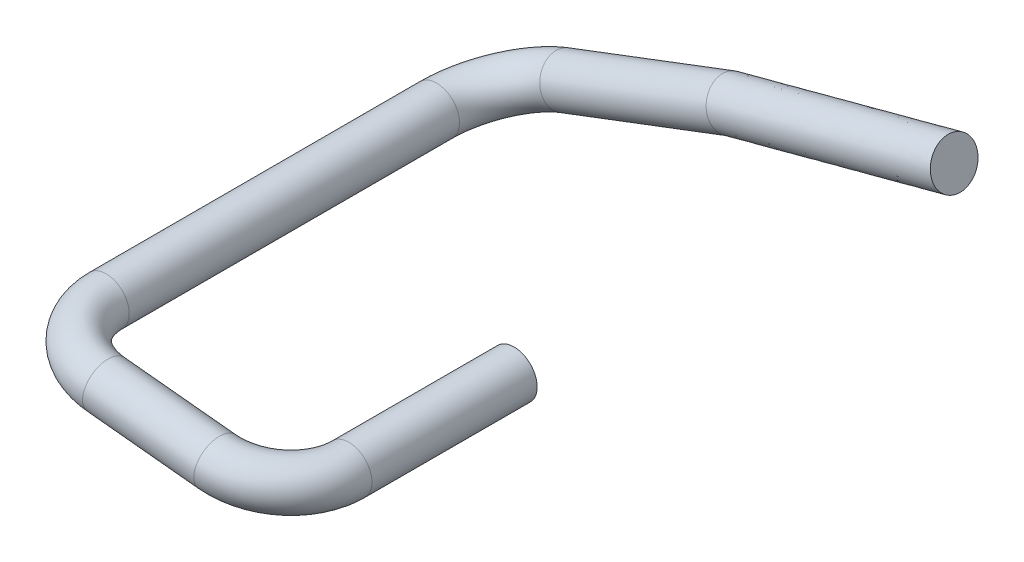
ISO-10303-21;
HEADER;
FILE_DESCRIPTION(('STEP AP214'),'2;1');
FILE_NAME('part.step','',(''),(''),'','','');
FILE_SCHEMA(('AUTOMOTIVE_DESIGN { 1 0 10303 214 1 1 1 1 }'));
ENDSEC;
DATA;
#1=APPLICATION_CONTEXT('core data for automotive mechanical design processes');
#2=APPLICATION_PROTOCOL_DEFINITION('international standard','automotive_design',2000,#1);
#3=PRODUCT_CONTEXT('',#1,'mechanical');
#4=PRODUCT('Part','Part','',(#3));
#5=PRODUCT_RELATED_PRODUCT_CATEGORY('part','',(#4));
#6=PRODUCT_DEFINITION_FORMATION('','',#4);
#7=PRODUCT_DEFINITION_CONTEXT('part definition',#1,'design');
#8=PRODUCT_DEFINITION('design','',#6,#7);
#9=PRODUCT_DEFINITION_SHAPE('','',#8);
#10=(LENGTH_UNIT() NAMED_UNIT(*) SI_UNIT(.MILLI.,.METRE.));
#11=(NAMED_UNIT(*) PLANE_ANGLE_UNIT() SI_UNIT($,.RADIAN.));
#12=(NAMED_UNIT(*) SI_UNIT($,.STERADIAN.) SOLID_ANGLE_UNIT());
#13=UNCERTAINTY_MEASURE_WITH_UNIT(LENGTH_MEASURE(1.E-05),#10,'distance_accuracy_value','');
#14=(GEOMETRIC_REPRESENTATION_CONTEXT(3) GLOBAL_UNCERTAINTY_ASSIGNED_CONTEXT((#13)) GLOBAL_UNIT_ASSIGNED_CONTEXT((#10,
#11,#12)) REPRESENTATION_CONTEXT('',''));
#15=CARTESIAN_POINT('',(0.,0.,0.));
#16=DIRECTION('',(0.,0.,1.));
#17=DIRECTION('',(1.,0.,0.));
#18=AXIS2_PLACEMENT_3D('',#15,#16,#17);
#19=CARTESIAN_POINT('',(6.5,0.,0.));
#20=DIRECTION('',(0.,0.,-1.));
#21=DIRECTION('',(-1.,0.,0.));
#22=AXIS2_PLACEMENT_3D('',#19,#20,#21);
#23=PLANE('',#22);
#24=CARTESIAN_POINT('',(6.5,0.,0.));
#25=DIRECTION('',(0.,0.,-1.));
#26=DIRECTION('',(0.,1.,0.));
#27=AXIS2_PLACEMENT_3D('',#24,#25,#26);
#28=CIRCLE('',#27,0.35);
#29=CARTESIAN_POINT('',(6.5,0.349999999999999,0.));
#30=VERTEX_POINT('',#29);
#31=EDGE_CURVE('E18',#30,#30,#28,.F.);
#32=ORIENTED_EDGE('',*,*,#31,.F.);
#33=EDGE_LOOP('',(#32));
#34=FACE_BOUND('',#33,.T.);
#35=ADVANCED_FACE('F15',(#34),#23,.T.);
#36=CARTESIAN_POINT('',(6.5,0.,2.5));
#37=DIRECTION('',(0.,0.,-1.));
#38=DIRECTION('',(0.,1.,0.));
#39=AXIS2_PLACEMENT_3D('',#36,#37,#38);
#40=CYLINDRICAL_SURFACE('',#39,0.35);
#41=CARTESIAN_POINT('',(6.5,0.,2.5));
#42=DIRECTION('',(0.,0.,-1.));
#43=DIRECTION('',(0.994914151503573,-0.100726516558078,0.));
#44=AXIS2_PLACEMENT_3D('',#41,#42,#43);
#45=CIRCLE('',#44,0.35);
#46=CARTESIAN_POINT('',(6.84821995302625,-0.0352542807953284,2.5));
#47=VERTEX_POINT('',#46);
#48=EDGE_CURVE('E58',#47,#47,#45,.F.);
#49=ORIENTED_EDGE('',*,*,#48,.F.);
#50=EDGE_LOOP('',(#49));
#51=FACE_BOUND('',#50,.T.);
#52=ORIENTED_EDGE('',*,*,#31,.T.);
#53=EDGE_LOOP('',(#52));
#54=FACE_BOUND('',#53,.T.);
#55=ADVANCED_FACE('F73',(#51,#54),#40,.T.);
#56=CARTESIAN_POINT('',(9.53167313141475,3.06935216086955,-3.50000000000001));
#57=DIRECTION('',(-0.966079467892424,-0.258244964552442,0.));
#58=DIRECTION('',(0.258244964552442,-0.966079467892424,0.));
#59=AXIS2_PLACEMENT_3D('',#56,#57,#58);
#60=PLANE('',#59);
#61=CARTESIAN_POINT('',(9.66076169643821,2.58643930940313,-3.15));
#62=CARTESIAN_POINT('',(9.66579720338818,2.56760176930539,-3.14999791451422));
#63=CARTESIAN_POINT('',(9.67082945589496,2.54877640389131,-3.15164861973238));
#64=CARTESIAN_POINT('',(9.68075865150334,2.5116318577176,-3.15820215186045));
#65=CARTESIAN_POINT('',(9.68565542420501,2.49331331441426,-3.16310889617471));
#66=CARTESIAN_POINT('',(9.69515938605322,2.4577595431293,-3.17602802954534));
#67=CARTESIAN_POINT('',(9.69976697098423,2.44052283454092,-3.18403606147579));
#68=CARTESIAN_POINT('',(9.708577195344,2.40756429505399,-3.20293836809555));
#69=CARTESIAN_POINT('',(9.71277926257943,2.39184460469759,-3.21383664204717));
#70=CARTESIAN_POINT('',(9.72065708811174,2.36237411526678,-3.23821120968002));
#71=CARTESIAN_POINT('',(9.72433236731732,2.34862510844519,-3.25168982438119));
#72=CARTESIAN_POINT('',(9.73105504360669,2.32347596548437,-3.28085385863624));
#73=CARTESIAN_POINT('',(9.73410154279563,2.31207918831782,-3.29654238090849));
#74=CARTESIAN_POINT('',(9.73948562562265,2.29193764603592,-3.3297241401582));
#75=CARTESIAN_POINT('',(9.74182071322194,2.28320221845725,-3.34722344924271));
#76=CARTESIAN_POINT('',(9.74570632433112,2.26866637215606,-3.38351159811163));
#77=CARTESIAN_POINT('',(9.74725572658146,2.26287014800062,-3.40230223761452));
#78=CARTESIAN_POINT('',(9.74952626736976,2.25437618630655,-3.44068240878773));
#79=CARTESIAN_POINT('',(9.75024475482607,2.25168836631098,-3.4602742921608));
#80=CARTESIAN_POINT('',(9.7508252828597,2.24951664453204,-3.49967521497899));
#81=CARTESIAN_POINT('',(9.75068610980258,2.25003728288488,-3.51948452253353));
#82=CARTESIAN_POINT('',(9.74955177985591,2.2542807455723,-3.55875041429241));
#83=CARTESIAN_POINT('',(9.74855585022945,2.25800646067096,-3.57820666388163));
#84=CARTESIAN_POINT('',(9.74573235736935,2.26856898406655,-3.61622221705729));
#85=CARTESIAN_POINT('',(9.74390363222358,2.27541013900954,-3.63478022727051));
#86=CARTESIAN_POINT('',(9.73947029877668,2.29199498287975,-3.67039560466865));
#87=CARTESIAN_POINT('',(9.73686755759817,2.30173168700931,-3.68745645655268));
#88=CARTESIAN_POINT('',(9.73095291316165,2.32385802956901,-3.71965954156408));
#89=CARTESIAN_POINT('',(9.72764003504181,2.33625131490082,-3.73479909121704));
#90=CARTESIAN_POINT('',(9.72041991020155,2.36326138410349,-3.76261732943667));
#91=CARTESIAN_POINT('',(9.71651588567207,2.37786611394445,-3.77530855844652));
#92=CARTESIAN_POINT('',(9.70820508392003,2.40895634235717,-3.79797552778187));
#93=CARTESIAN_POINT('',(9.70379762183473,2.42544440296082,-3.80794750495601));
#94=CARTESIAN_POINT('',(9.69464062274781,2.45970020663432,-3.82480301232005));
#95=CARTESIAN_POINT('',(9.68989352229551,2.4774588347142,-3.83170639480795));
#96=CARTESIAN_POINT('',(9.68015869907059,2.51387624504961,-3.84232671879145));
#97=CARTESIAN_POINT('',(9.67517059392555,2.53253645773822,-3.84603840854675));
#98=CARTESIAN_POINT('',(9.66512427396176,2.57011915934758,-3.85013798230738));
#99=CARTESIAN_POINT('',(9.66006641771977,2.58904030685343,-3.85053905206071));
#100=CARTESIAN_POINT('',(9.65001379160875,2.62664659939464,-3.84804246805131));
#101=CARTESIAN_POINT('',(9.64501893062779,2.64533208527448,-3.84515031230122));
#102=CARTESIAN_POINT('',(9.63522375326206,2.681975276958,-3.8361591942369));
#103=CARTESIAN_POINT('',(9.63042350513207,2.6999327274245,-3.83005911713987));
#104=CARTESIAN_POINT('',(9.62116151072463,2.73458131251603,-3.81483995978501));
#105=CARTESIAN_POINT('',(9.61669930869625,2.75127415207896,-3.80572503646304));
#106=CARTESIAN_POINT('',(9.60821596127665,2.78300986384892,-3.78469982572047));
#107=CARTESIAN_POINT('',(9.60419642287994,2.79804672438244,-3.77277981625736));
#108=CARTESIAN_POINT('',(9.59673386299468,2.82596372905884,-3.74652325340762));
#109=CARTESIAN_POINT('',(9.59329007054916,2.83884675730709,-3.73218998401346));
#110=CARTESIAN_POINT('',(9.58704881253152,2.86219494237282,-3.7014120221235));
#111=CARTESIAN_POINT('',(9.58425527118697,2.87264541888205,-3.68495539656457));
#112=CARTESIAN_POINT('',(9.5794211422435,2.8907296155111,-3.65048969385263));
#113=CARTESIAN_POINT('',(9.57737954125889,2.8983671266482,-3.63248274676345));
#114=CARTESIAN_POINT('',(9.57408922245147,2.91067601889775,-3.59528619564929));
#115=CARTESIAN_POINT('',(9.57284558643152,2.91532838927983,-3.57608984903491));
#116=CARTESIAN_POINT('',(9.5712070231959,2.92145815952149,-3.5371890817355));
#117=CARTESIAN_POINT('',(9.57081093274273,2.92293991098529,-3.51748539502593));
#118=CARTESIAN_POINT('',(9.5708749398144,2.92270046423423,-3.47800790954186));
#119=CARTESIAN_POINT('',(9.57133897780114,2.92096452497942,-3.45823420435761));
#120=CARTESIAN_POINT('',(9.57311697431509,2.91431314291244,-3.41929704299045));
#121=CARTESIAN_POINT('',(9.5744297385202,2.90940216799012,-3.40013276891868));
#122=CARTESIAN_POINT('',(9.57787045719635,2.89653063853521,-3.36290239359777));
#123=CARTESIAN_POINT('',(9.57999961046557,2.888565599368,-3.34483795277843));
#124=CARTESIAN_POINT('',(9.58501015375496,2.86982144687984,-3.31038146906657));
#125=CARTESIAN_POINT('',(9.58789046290857,2.85904637701813,-3.29398706984509));
#126=CARTESIAN_POINT('',(9.5943187049197,2.83499869565345,-3.26334075346839));
#127=CARTESIAN_POINT('',(9.59786549379887,2.82173036370725,-3.24908523933583));
#128=CARTESIAN_POINT('',(9.6055243051751,2.79307919356007,-3.22311638839694));
#129=CARTESIAN_POINT('',(9.60963551394584,2.77769939946217,-3.2113994532998));
#130=CARTESIAN_POINT('',(9.61829515563471,2.74530418103297,-3.19086262764124));
#131=CARTESIAN_POINT('',(9.62284195771898,2.72829485755676,-3.18203243820997));
#132=CARTESIAN_POINT('',(9.6322476636957,2.693108655801,-3.16747886321081));
#133=CARTESIAN_POINT('',(9.63710617303502,2.67493325352196,-3.161751633482));
#134=CARTESIAN_POINT('',(9.64819857214203,2.63343723037382,-3.15257510473023));
#135=CARTESIAN_POINT('',(9.65448266443676,2.60992880475629,-3.15000260049924));
#136=CARTESIAN_POINT('',(9.66076169643821,2.58643930940313,-3.15));
#137=B_SPLINE_CURVE_WITH_KNOTS('',3,(#61,#62,#63,#64,#65,#66,#67,#68,#69,#70,#71,#72,#73,#74,
#75,#76,#77,#78,#79,#80,#81,#82,#83,#84,#85,#86,#87,#88,#89,#90,#91,#92,#93,#94,#95,#96,#97,#98,
#99,#100,#101,#102,#103,#104,#105,#106,#107,#108,#109,#110,#111,#112,#113,#114,#115,#116,#117,
#118,#119,#120,#121,#122,#123,#124,#125,#126,#127,#128,#129,#130,#131,#132,#133,#134,#135,#136),
.UNSPECIFIED.,.T.,.F.,(4,2,2,2,2,2,2,2,2,2,2,2,2,2,2,2,2,2,2,2,2,2,2,2,2,2,2,2,2,2,2,2,2,2,2,2,
2,4),(0.,0.0584059861638105,0.116882369424953,0.175276893134587,0.233752643488833,
0.292281242123789,0.350892849719176,0.40970779296729,0.468606437050331,0.527692486684429,
0.586862165346322,0.64608526710625,0.70539125099245,0.764555318522248,0.82380113148163,
0.882734920467541,0.941749858264383,1.00037723472733,1.05910089545681,1.11759055443898,
1.17598270840894,1.2343951676229,1.29272741989049,1.35126490127167,1.40972335863189,
1.46852595672178,1.52724901436823,1.58634242954722,1.6453546881634,1.70463796501443,
1.76383799986117,1.82312529993264,1.8823277555172,1.94142950627981,2.00044692752229,
2.0592514378247,2.11798292947795,2.19081235059521),.UNSPECIFIED.);
#138=CARTESIAN_POINT('',(9.66076169643821,2.58643930940313,-3.15));
#139=VERTEX_POINT('',#138);
#140=EDGE_CURVE('E55',#139,#139,#137,.T.);
#141=ORIENTED_EDGE('',*,*,#140,.T.);
#142=EDGE_LOOP('',(#141));
#143=FACE_BOUND('',#142,.T.);
#144=ADVANCED_FACE('F66',(#143),#60,.F.);
#145=CARTESIAN_POINT('',(5.50508584849643,0.100726516558077,2.5));
#146=DIRECTION('',(0.100726516558078,0.994914151503573,0.));
#147=DIRECTION('',(0.,0.,1.));
#148=AXIS2_PLACEMENT_3D('',#145,#146,#147);
#149=TOROIDAL_SURFACE('',#148,1.,0.35);
#150=CARTESIAN_POINT('',(5.50508584849643,0.100726516558077,3.5));
#151=DIRECTION('',(0.994914151503573,-0.100726516558078,0.));
#152=DIRECTION('',(0.100726516558078,0.994914151503573,0.));
#153=AXIS2_PLACEMENT_3D('',#150,#151,#152);
#154=CIRCLE('',#153,0.35);
#155=CARTESIAN_POINT('',(5.54034012929176,0.448946469584328,3.5));
#156=VERTEX_POINT('',#155);
#157=EDGE_CURVE('E52',#156,#156,#154,.F.);
#158=ORIENTED_EDGE('',*,*,#157,.F.);
#159=EDGE_LOOP('',(#158));
#160=FACE_BOUND('',#159,.T.);
#161=ORIENTED_EDGE('',*,*,#48,.T.);
#162=EDGE_LOOP('',(#161));
#163=FACE_BOUND('',#162,.T.);
#164=ADVANCED_FACE('F61',(#160,#163),#149,.T.);
#165=CARTESIAN_POINT('',(6.23669411816194,1.67114378790097,-3.15));
#166=CARTESIAN_POINT('',(6.32661474119793,1.33475594078179,-3.14999999999999));
#167=CARTESIAN_POINT('',(6.32661474119793,1.33475594078178,-3.49999999999999));
#168=CARTESIAN_POINT('',(6.32661474119793,1.33475594078178,-3.84999999999999));
#169=CARTESIAN_POINT('',(6.23669411816194,1.67114378790095,-3.85));
#170=CARTESIAN_POINT('',(6.14677349512595,2.00753163502013,-3.85000000000001));
#171=CARTESIAN_POINT('',(6.14677349512595,2.00753163502014,-3.50000000000001));
#172=CARTESIAN_POINT('',(6.14677349512595,2.00753163502015,-3.15000000000001));
#173=CARTESIAN_POINT('',(6.23669411816194,1.67114378790097,-3.15));
#174=CARTESIAN_POINT('',(9.66076169643821,2.58643930940313,-3.15));
#175=CARTESIAN_POINT('',(9.7506823194742,2.25005146228395,-3.14999999999999));
#176=CARTESIAN_POINT('',(9.75068231947421,2.25005146228394,-3.49999999999999));
#177=CARTESIAN_POINT('',(9.75068231947421,2.25005146228393,-3.84999999999999));
#178=CARTESIAN_POINT('',(9.66076169643822,2.58643930940311,-3.85));
#179=CARTESIAN_POINT('',(9.57084107340223,2.92282715652229,-3.85000000000001));
#180=CARTESIAN_POINT('',(9.57084107340223,2.9228271565223,-3.50000000000001));
#181=CARTESIAN_POINT('',(9.57084107340222,2.92282715652231,-3.15000000000001));
#182=CARTESIAN_POINT('',(9.66076169643821,2.58643930940313,-3.15));
#183=(BOUNDED_SURFACE() B_SPLINE_SURFACE(1,2,((#165,#166,#167,#168,#169,#170,#171,#172,#173),
(#174,#175,#176,#177,#178,#179,#180,#181,#182)),.UNSPECIFIED.,.F.,.T.,
.F.) B_SPLINE_SURFACE_WITH_KNOTS((2,2),(3,2,2,2,3),(-0.123692139524501,10.002855984916),
(-3.14159265358979,-1.5707963267949,0.,1.5707963267949,3.14159265358979),
.UNSPECIFIED.) GEOMETRIC_REPRESENTATION_ITEM() RATIONAL_B_SPLINE_SURFACE(((1.,0.707106781186548,
1.,0.707106781186548,1.,0.707106781186548,1.,0.707106781186548,1.),(1.,0.707106781186548,1.,
0.707106781186548,1.,0.707106781186548,1.,0.707106781186548,1.))) REPRESENTATION_ITEM('') SURFACE());
#184=CARTESIAN_POINT('',(6.27851787087895,1.68232379316639,-3.5));
#185=DIRECTION('',(0.934943333045712,0.35479707438672,0.));
#186=DIRECTION('',(-0.35479707438672,0.934943333045712,0.));
#187=AXIS2_PLACEMENT_3D('',#184,#185,#186);
#188=CIRCLE('',#187,0.35);
#189=CARTESIAN_POINT('',(6.27851787087895,1.68232379316639,-3.15));
#190=VERTEX_POINT('',#189);
#191=EDGE_CURVE('E51',#190,#190,#188,.F.);
#192=CARTESIAN_POINT('',(6.27851787087895,1.68232379316639,-3.15));
#193=CARTESIAN_POINT('',(6.31374957739519,1.69174166312719,-3.15));
#194=CARTESIAN_POINT('',(6.34898128391143,1.70115953308799,-3.15));
#195=CARTESIAN_POINT('',(6.41944469694392,1.71999527300959,-3.15));
#196=CARTESIAN_POINT('',(6.45467640346016,1.72941314297039,-3.15));
#197=CARTESIAN_POINT('',(6.52513981649264,1.74824888289199,-3.15));
#198=CARTESIAN_POINT('',(6.56037152300889,1.75766675285279,-3.15));
#199=CARTESIAN_POINT('',(6.63083493604137,1.77650249277439,-3.15));
#200=CARTESIAN_POINT('',(6.66606664255761,1.78592036273519,-3.15));
#201=CARTESIAN_POINT('',(6.7365300555901,1.80475610265678,-3.15));
#202=CARTESIAN_POINT('',(6.77176176210634,1.81417397261758,-3.15));
#203=CARTESIAN_POINT('',(6.84222517513883,1.83300971253918,-3.15));
#204=CARTESIAN_POINT('',(6.87745688165507,1.84242758249998,-3.15));
#205=CARTESIAN_POINT('',(6.94792029468755,1.86126332242158,-3.15));
#206=CARTESIAN_POINT('',(6.98315200120379,1.87068119238238,-3.15));
#207=CARTESIAN_POINT('',(7.05361541423628,1.88951693230398,-3.15));
#208=CARTESIAN_POINT('',(7.08884712075252,1.89893480226478,-3.15));
#209=CARTESIAN_POINT('',(7.15931053378501,1.91777054218638,-3.15));
#210=CARTESIAN_POINT('',(7.19454224030125,1.92718841214718,-3.15));
#211=CARTESIAN_POINT('',(7.26500565333373,1.94602415206877,-3.15));
#212=CARTESIAN_POINT('',(7.30023735984997,1.95544202202957,-3.15));
#213=CARTESIAN_POINT('',(7.37070077288246,1.97427776195117,-3.15));
#214=CARTESIAN_POINT('',(7.4059324793987,1.98369563191197,-3.15));
#215=CARTESIAN_POINT('',(7.47639589243119,2.00253137183357,-3.15));
#216=CARTESIAN_POINT('',(7.51162759894743,2.01194924179437,-3.15));
#217=CARTESIAN_POINT('',(7.58209101197991,2.03078498171597,-3.15));
#218=CARTESIAN_POINT('',(7.61732271849615,2.04020285167677,-3.15));
#219=CARTESIAN_POINT('',(7.68778613152864,2.05903859159837,-3.15));
#220=CARTESIAN_POINT('',(7.72301783804488,2.06845646155917,-3.15));
#221=CARTESIAN_POINT('',(7.79348125107737,2.08729220148077,-3.15));
#222=CARTESIAN_POINT('',(7.82871295759361,2.09671007144156,-3.15));
#223=CARTESIAN_POINT('',(7.89917637062609,2.11554581136316,-3.15));
#224=CARTESIAN_POINT('',(7.93440807714234,2.12496368132396,-3.15));
#225=CARTESIAN_POINT('',(8.00487149017482,2.14379942124556,-3.15));
#226=CARTESIAN_POINT('',(8.04010319669106,2.15321729120636,-3.15));
#227=CARTESIAN_POINT('',(8.11056660972355,2.17205303112796,-3.15));
#228=CARTESIAN_POINT('',(8.14579831623979,2.18147090108876,-3.15));
#229=CARTESIAN_POINT('',(8.21626172927228,2.20030664101036,-3.15));
#230=CARTESIAN_POINT('',(8.25149343578852,2.20972451097116,-3.15));
#231=CARTESIAN_POINT('',(8.321956848821,2.22856025089275,-3.15));
#232=CARTESIAN_POINT('',(8.35718855533725,2.23797812085355,-3.15));
#233=CARTESIAN_POINT('',(8.42765196836973,2.25681386077515,-3.15));
#234=CARTESIAN_POINT('',(8.46288367488597,2.26623173073595,-3.15));
#235=CARTESIAN_POINT('',(8.53334708791846,2.28506747065755,-3.15));
#236=CARTESIAN_POINT('',(8.5685787944347,2.29448534061835,-3.15));
#237=CARTESIAN_POINT('',(8.63904220746718,2.31332108053995,-3.15));
#238=CARTESIAN_POINT('',(8.67427391398343,2.32273895050075,-3.15));
#239=CARTESIAN_POINT('',(8.74473732701591,2.34157469042235,-3.15));
#240=CARTESIAN_POINT('',(8.77996903353215,2.35099256038315,-3.15));
#241=CARTESIAN_POINT('',(8.85043244656464,2.36982830030475,-3.15));
#242=CARTESIAN_POINT('',(8.88566415308088,2.37924617026554,-3.15));
#243=CARTESIAN_POINT('',(8.95612756611336,2.39808191018714,-3.15));
#244=CARTESIAN_POINT('',(8.99135927262961,2.40749978014794,-3.15));
#245=CARTESIAN_POINT('',(9.06182268566209,2.42633552006954,-3.15));
#246=CARTESIAN_POINT('',(9.09705439217833,2.43575339003034,-3.15));
#247=CARTESIAN_POINT('',(9.16751780521082,2.45458912995194,-3.15));
#248=CARTESIAN_POINT('',(9.20274951172706,2.46400699991274,-3.15));
#249=CARTESIAN_POINT('',(9.27321292475954,2.48284273983434,-3.15));
#250=CARTESIAN_POINT('',(9.30844463127579,2.49226060979514,-3.15));
#251=CARTESIAN_POINT('',(9.37890804430827,2.51109634971674,-3.15));
#252=CARTESIAN_POINT('',(9.41413975082451,2.52051421967753,-3.15));
#253=CARTESIAN_POINT('',(9.484603163857,2.53934995959913,-3.15));
#254=CARTESIAN_POINT('',(9.51983487037324,2.54876782955993,-3.15));
#255=CARTESIAN_POINT('',(9.59029828340572,2.56760356948153,-3.15));
#256=CARTESIAN_POINT('',(9.62552998992197,2.57702143944233,-3.15));
#257=CARTESIAN_POINT('',(9.66076169643821,2.58643930940313,-3.15));
#258=B_SPLINE_CURVE_WITH_KNOTS('',3,(#192,#193,#194,#195,#196,#197,#198,#199,#200,#201,#202,
#203,#204,#205,#206,#207,#208,#209,#210,#211,#212,#213,#214,#215,#216,#217,#218,#219,#220,#221,
#222,#223,#224,#225,#226,#227,#228,#229,#230,#231,#232,#233,#234,#235,#236,#237,#238,#239,#240,
#241,#242,#243,#244,#245,#246,#247,#248,#249,#250,#251,#252,#253,#254,#255,#256,#257),
.UNSPECIFIED.,.F.,.F.,(4,2,2,2,2,2,2,2,2,2,2,2,2,2,2,2,2,2,2,2,2,2,2,2,2,2,2,2,2,2,2,2,4),(0.,
0.109406237335018,0.218812474670038,0.328218712005055,0.437624949340074,0.547031186675093,
0.656437424010111,0.76584366134513,0.875249898680148,0.984656136015168,1.09406237335019,
1.2034686106852,1.31287484802022,1.42228108535524,1.53168732269026,1.64109356002528,
1.7504997973603,1.85990603469532,1.96931227203034,2.07871850936535,2.18812474670037,
2.29753098403539,2.40693722137041,2.51634345870543,2.62574969604045,2.73515593337546,
2.84456217071048,2.9539684080455,3.06337464538052,3.17278088271554,3.28218712005056,
3.39159335738557,3.50099959472059),.UNSPECIFIED.);
#259=EDGE_CURVE('BSEAM65',#190,#139,#258,.T.);
#260=ORIENTED_EDGE('',*,*,#191,.F.);
#261=ORIENTED_EDGE('',*,*,#140,.F.);
#262=ORIENTED_EDGE('',*,*,#259,.T.);
#263=ORIENTED_EDGE('',*,*,#259,.F.);
#264=EDGE_LOOP('',(#260,#262,#261,#263));
#265=FACE_BOUND('',#264,.T.);
#266=ADVANCED_FACE('F65',(#265),#183,.F.);
#267=CARTESIAN_POINT('',(3.82053200641893,0.271273131269069,3.5));
#268=DIRECTION('',(0.994914151503573,-0.100726516558078,0.));
#269=DIRECTION('',(0.100726516558078,0.994914151503573,0.));
#270=AXIS2_PLACEMENT_3D('',#267,#268,#269);
#271=CYLINDRICAL_SURFACE('',#270,0.35);
#272=CARTESIAN_POINT('',(3.82053200641893,0.271273131269069,3.5));
#273=DIRECTION('',(0.994914151503573,-0.100726516558078,0.));
#274=DIRECTION('',(0.,0.,1.));
#275=AXIS2_PLACEMENT_3D('',#272,#273,#274);
#276=CIRCLE('',#275,0.35);
#277=CARTESIAN_POINT('',(3.82053200641893,0.271273131269069,3.85));
#278=VERTEX_POINT('',#277);
#279=EDGE_CURVE('E48',#278,#278,#276,.F.);
#280=ORIENTED_EDGE('',*,*,#279,.F.);
#281=EDGE_LOOP('',(#280));
#282=FACE_BOUND('',#281,.T.);
#283=ORIENTED_EDGE('',*,*,#157,.T.);
#284=EDGE_LOOP('',(#283));
#285=FACE_BOUND('',#284,.T.);
#286=ADVANCED_FACE('F84',(#282,#285),#271,.T.);
#287=CARTESIAN_POINT('',(3.76056118796107,0.726796722213867,-3.5));
#288=DIRECTION('',(0.934943333045712,0.35479707438672,0.));
#289=DIRECTION('',(-0.35479707438672,0.934943333045712,0.));
#290=AXIS2_PLACEMENT_3D('',#287,#288,#289);
#291=CYLINDRICAL_SURFACE('',#290,0.35);
#292=CARTESIAN_POINT('',(3.76056118796107,0.726796722213867,-3.5));
#293=DIRECTION('',(0.934943333045712,0.35479707438672,0.));
#294=DIRECTION('',(0.,0.,-1.));
#295=AXIS2_PLACEMENT_3D('',#292,#293,#294);
#296=CIRCLE('',#295,0.35);
#297=CARTESIAN_POINT('',(3.76056118796107,0.726796722213867,-3.85));
#298=VERTEX_POINT('',#297);
#299=EDGE_CURVE('E27',#298,#298,#296,.F.);
#300=ORIENTED_EDGE('',*,*,#299,.F.);
#301=EDGE_LOOP('',(#300));
#302=FACE_BOUND('',#301,.T.);
#303=ORIENTED_EDGE('',*,*,#191,.T.);
#304=EDGE_LOOP('',(#303));
#305=FACE_BOUND('',#304,.T.);
#306=ADVANCED_FACE('F43',(#302,#305),#291,.T.);
#307=CARTESIAN_POINT('',(3.82053200641893,0.271273131269069,2.5));
#308=DIRECTION('',(0.100726516558078,0.994914151503573,0.));
#309=DIRECTION('',(0.,0.,1.));
#310=AXIS2_PLACEMENT_3D('',#307,#308,#309);
#311=TOROIDAL_SURFACE('',#310,1.,0.35);
#312=CARTESIAN_POINT('',(2.82561785491536,0.371999647827147,2.5));
#313=DIRECTION('',(0.,0.,1.));
#314=DIRECTION('',(0.,-1.,0.));
#315=AXIS2_PLACEMENT_3D('',#312,#313,#314);
#316=CIRCLE('',#315,0.35);
#317=CARTESIAN_POINT('',(2.82561785491536,0.021999647827147,2.5));
#318=VERTEX_POINT('',#317);
#319=EDGE_CURVE('E22',#318,#318,#316,.F.);
#320=ORIENTED_EDGE('',*,*,#319,.F.);
#321=EDGE_LOOP('',(#320));
#322=FACE_BOUND('',#321,.T.);
#323=ORIENTED_EDGE('',*,*,#279,.T.);
#324=EDGE_LOOP('',(#323));
#325=FACE_BOUND('',#324,.T.);
#326=ADVANCED_FACE('F39',(#322,#325),#311,.T.);
#327=CARTESIAN_POINT('',(3.76056118796107,0.726796722213867,-2.5));
#328=DIRECTION('',(0.35479707438672,-0.934943333045712,0.));
#329=DIRECTION('',(0.,0.,-1.));
#330=AXIS2_PLACEMENT_3D('',#327,#328,#329);
#331=TOROIDAL_SURFACE('',#330,1.,0.35);
#332=CARTESIAN_POINT('',(2.82561785491536,0.371999647827147,-2.5));
#333=DIRECTION('',(0.,0.,1.));
#334=DIRECTION('',(0.,-1.,0.));
#335=AXIS2_PLACEMENT_3D('',#332,#333,#334);
#336=CIRCLE('',#335,0.35);
#337=CARTESIAN_POINT('',(2.82561785491536,0.0219996478271469,-2.5));
#338=VERTEX_POINT('',#337);
#339=EDGE_CURVE('E10',#338,#338,#336,.T.);
#340=ORIENTED_EDGE('',*,*,#339,.F.);
#341=EDGE_LOOP('',(#340));
#342=FACE_BOUND('',#341,.T.);
#343=ORIENTED_EDGE('',*,*,#299,.T.);
#344=EDGE_LOOP('',(#343));
#345=FACE_BOUND('',#344,.T.);
#346=ADVANCED_FACE('F34',(#342,#345),#331,.T.);
#347=CARTESIAN_POINT('',(2.82561785491536,0.371999647827147,0.));
#348=DIRECTION('',(0.,0.,1.));
#349=DIRECTION('',(0.,-1.,0.));
#350=AXIS2_PLACEMENT_3D('',#347,#348,#349);
#351=CYLINDRICAL_SURFACE('',#350,0.35);
#352=ORIENTED_EDGE('',*,*,#339,.T.);
#353=EDGE_LOOP('',(#352));
#354=FACE_BOUND('',#353,.T.);
#355=ORIENTED_EDGE('',*,*,#319,.T.);
#356=EDGE_LOOP('',(#355));
#357=FACE_BOUND('',#356,.T.);
#358=ADVANCED_FACE('F38',(#354,#357),#351,.T.);
#359=CLOSED_SHELL('',(#35,#55,#144,#164,#266,#286,#306,#326,#346,#358));
#360=MANIFOLD_SOLID_BREP('B1',#359);
#361=ADVANCED_BREP_SHAPE_REPRESENTATION('',(#18,#360),#14);
#362=SHAPE_DEFINITION_REPRESENTATION(#9,#361);
ENDSEC;
END-ISO-10303-21;
